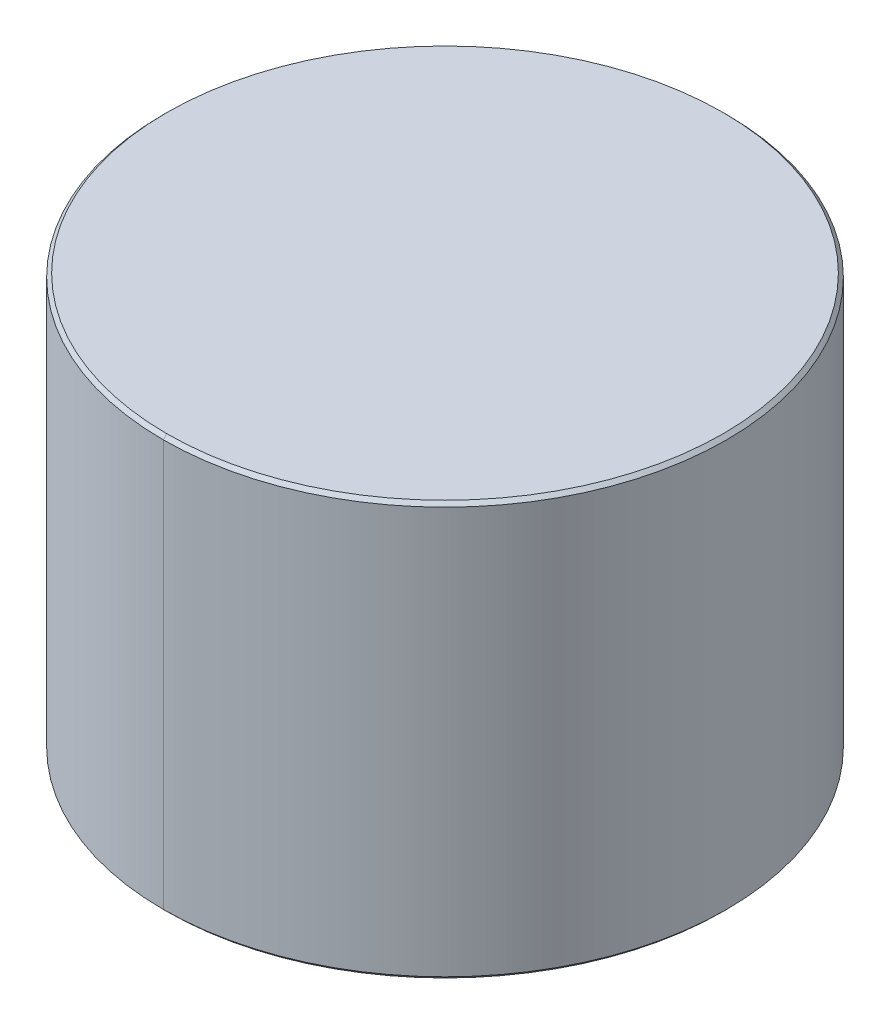
ISO-10303-21;
HEADER;
FILE_DESCRIPTION(('STEP AP214'),'2;1');
FILE_NAME('part.step','',(''),(''),'','','');
FILE_SCHEMA(('AUTOMOTIVE_DESIGN { 1 0 10303 214 1 1 1 1 }'));
ENDSEC;
DATA;
#1=APPLICATION_CONTEXT('core data for automotive mechanical design processes');
#2=APPLICATION_PROTOCOL_DEFINITION('international standard','automotive_design',2000,#1);
#3=PRODUCT_CONTEXT('',#1,'mechanical');
#4=PRODUCT('Part','Part','',(#3));
#5=PRODUCT_RELATED_PRODUCT_CATEGORY('part','',(#4));
#6=PRODUCT_DEFINITION_FORMATION('','',#4);
#7=PRODUCT_DEFINITION_CONTEXT('part definition',#1,'design');
#8=PRODUCT_DEFINITION('design','',#6,#7);
#9=PRODUCT_DEFINITION_SHAPE('','',#8);
#10=(LENGTH_UNIT() NAMED_UNIT(*) SI_UNIT(.MILLI.,.METRE.));
#11=(NAMED_UNIT(*) PLANE_ANGLE_UNIT() SI_UNIT($,.RADIAN.));
#12=(NAMED_UNIT(*) SI_UNIT($,.STERADIAN.) SOLID_ANGLE_UNIT());
#13=UNCERTAINTY_MEASURE_WITH_UNIT(LENGTH_MEASURE(1.E-05),#10,'distance_accuracy_value','');
#14=(GEOMETRIC_REPRESENTATION_CONTEXT(3) GLOBAL_UNCERTAINTY_ASSIGNED_CONTEXT((#13)) GLOBAL_UNIT_ASSIGNED_CONTEXT((#10,
#11,#12)) REPRESENTATION_CONTEXT('',''));
#15=CARTESIAN_POINT('',(0.,0.,0.));
#16=DIRECTION('',(0.,0.,1.));
#17=DIRECTION('',(1.,0.,0.));
#18=AXIS2_PLACEMENT_3D('',#15,#16,#17);
#19=CARTESIAN_POINT('',(0.,23.5,0.));
#20=DIRECTION('',(0.,-1.,0.));
#21=DIRECTION('',(0.,0.,-1.));
#22=AXIS2_PLACEMENT_3D('',#19,#20,#21);
#23=CONICAL_SURFACE('',#22,15.8,0.785398163397448);
#24=CARTESIAN_POINT('',(0.,23.5,0.));
#25=DIRECTION('',(0.,1.,0.));
#26=DIRECTION('',(0.,0.,1.));
#27=AXIS2_PLACEMENT_3D('',#24,#25,#26);
#28=CIRCLE('',#27,15.8);
#29=CARTESIAN_POINT('',(0.,23.5,15.8));
#30=VERTEX_POINT('',#29);
#31=CARTESIAN_POINT('',(0.,23.5,-15.8));
#32=VERTEX_POINT('',#31);
#33=EDGE_CURVE('E41',#30,#32,#28,.T.);
#34=ORIENTED_EDGE('',*,*,#33,.F.);
#35=DIRECTION('',(0.,-0.707106781186548,0.707106781186548));
#36=VECTOR('',#35,1.);
#37=CARTESIAN_POINT('',(0.,23.5,15.8));
#38=LINE('',#37,#36);
#39=CARTESIAN_POINT('',(0.,23.3,16.));
#40=VERTEX_POINT('',#39);
#41=EDGE_CURVE('E11',#30,#40,#38,.T.);
#42=ORIENTED_EDGE('',*,*,#41,.T.);
#43=CARTESIAN_POINT('',(0.,23.3,0.));
#44=DIRECTION('',(0.,-1.,0.));
#45=DIRECTION('',(0.,0.,1.));
#46=AXIS2_PLACEMENT_3D('',#43,#44,#45);
#47=CIRCLE('',#46,16.);
#48=CARTESIAN_POINT('',(0.,23.3,-16.));
#49=VERTEX_POINT('',#48);
#50=EDGE_CURVE('E84',#49,#40,#47,.T.);
#51=ORIENTED_EDGE('',*,*,#50,.F.);
#52=DIRECTION('',(0.,-0.707106781186548,-0.707106781186548));
#53=VECTOR('',#52,1.);
#54=CARTESIAN_POINT('',(0.,23.5,-15.8));
#55=LINE('',#54,#53);
#56=EDGE_CURVE('E111',#32,#49,#55,.T.);
#57=ORIENTED_EDGE('',*,*,#56,.F.);
#58=EDGE_LOOP('',(#34,#42,#51,#57));
#59=FACE_BOUND('',#58,.T.);
#60=ADVANCED_FACE('F16',(#59),#23,.T.);
#61=CARTESIAN_POINT('',(0.,0.2,0.));
#62=DIRECTION('',(0.,1.,0.));
#63=DIRECTION('',(0.,0.,1.));
#64=AXIS2_PLACEMENT_3D('',#61,#62,#63);
#65=CONICAL_SURFACE('',#64,16.,0.785398163397448);
#66=CARTESIAN_POINT('',(0.,0.,0.));
#67=DIRECTION('',(0.,-1.,0.));
#68=DIRECTION('',(0.,0.,1.));
#69=AXIS2_PLACEMENT_3D('',#66,#67,#68);
#70=CIRCLE('',#69,15.8);
#71=CARTESIAN_POINT('',(0.,0.,-15.8));
#72=VERTEX_POINT('',#71);
#73=CARTESIAN_POINT('',(0.,0.,15.8));
#74=VERTEX_POINT('',#73);
#75=EDGE_CURVE('E69',#72,#74,#70,.T.);
#76=ORIENTED_EDGE('',*,*,#75,.F.);
#77=DIRECTION('',(0.,0.707106781186548,-0.707106781186548));
#78=VECTOR('',#77,1.);
#79=CARTESIAN_POINT('',(0.,0.2,-16.));
#80=LINE('',#79,#78);
#81=CARTESIAN_POINT('',(0.,0.2,-16.));
#82=VERTEX_POINT('',#81);
#83=EDGE_CURVE('E27',#72,#82,#80,.T.);
#84=ORIENTED_EDGE('',*,*,#83,.T.);
#85=CARTESIAN_POINT('',(0.,0.2,0.));
#86=DIRECTION('',(0.,1.,0.));
#87=DIRECTION('',(0.,0.,1.));
#88=AXIS2_PLACEMENT_3D('',#85,#86,#87);
#89=CIRCLE('',#88,16.);
#90=CARTESIAN_POINT('',(0.,0.2,16.));
#91=VERTEX_POINT('',#90);
#92=EDGE_CURVE('E116',#91,#82,#89,.T.);
#93=ORIENTED_EDGE('',*,*,#92,.F.);
#94=DIRECTION('',(0.,0.707106781186548,0.707106781186548));
#95=VECTOR('',#94,1.);
#96=CARTESIAN_POINT('',(0.,0.2,16.));
#97=LINE('',#96,#95);
#98=EDGE_CURVE('E73',#74,#91,#97,.T.);
#99=ORIENTED_EDGE('',*,*,#98,.F.);
#100=EDGE_LOOP('',(#76,#84,#93,#99));
#101=FACE_BOUND('',#100,.T.);
#102=ADVANCED_FACE('F18',(#101),#65,.T.);
#103=CARTESIAN_POINT('',(0.,23.5,0.));
#104=DIRECTION('',(0.,-1.,0.));
#105=DIRECTION('',(0.,0.,-1.));
#106=AXIS2_PLACEMENT_3D('',#103,#104,#105);
#107=CYLINDRICAL_SURFACE('',#106,16.);
#108=ORIENTED_EDGE('',*,*,#50,.T.);
#109=DIRECTION('',(0.,-1.,0.));
#110=VECTOR('',#109,1.);
#111=CARTESIAN_POINT('',(0.,23.5,16.));
#112=LINE('',#111,#110);
#113=EDGE_CURVE('E110',#40,#91,#112,.T.);
#114=ORIENTED_EDGE('',*,*,#113,.T.);
#115=ORIENTED_EDGE('',*,*,#92,.T.);
#116=DIRECTION('',(0.,-1.,0.));
#117=VECTOR('',#116,1.);
#118=CARTESIAN_POINT('',(0.,23.5,-16.));
#119=LINE('',#118,#117);
#120=EDGE_CURVE('E128',#49,#82,#119,.T.);
#121=ORIENTED_EDGE('',*,*,#120,.F.);
#122=EDGE_LOOP('',(#108,#114,#115,#121));
#123=FACE_BOUND('',#122,.T.);
#124=ADVANCED_FACE('F121',(#123),#107,.T.);
#125=CARTESIAN_POINT('',(0.,23.5,0.));
#126=DIRECTION('',(0.,-1.,0.));
#127=DIRECTION('',(0.,0.,-1.));
#128=AXIS2_PLACEMENT_3D('',#125,#126,#127);
#129=CYLINDRICAL_SURFACE('',#128,16.);
#130=ORIENTED_EDGE('',*,*,#113,.F.);
#131=CARTESIAN_POINT('',(0.,23.3,0.));
#132=DIRECTION('',(0.,-1.,0.));
#133=DIRECTION('',(0.,0.,1.));
#134=AXIS2_PLACEMENT_3D('',#131,#132,#133);
#135=CIRCLE('',#134,16.);
#136=EDGE_CURVE('E104',#40,#49,#135,.T.);
#137=ORIENTED_EDGE('',*,*,#136,.T.);
#138=ORIENTED_EDGE('',*,*,#120,.T.);
#139=CARTESIAN_POINT('',(0.,0.2,0.));
#140=DIRECTION('',(0.,1.,0.));
#141=DIRECTION('',(0.,0.,1.));
#142=AXIS2_PLACEMENT_3D('',#139,#140,#141);
#143=CIRCLE('',#142,16.);
#144=EDGE_CURVE('E82',#82,#91,#143,.T.);
#145=ORIENTED_EDGE('',*,*,#144,.T.);
#146=EDGE_LOOP('',(#130,#137,#138,#145));
#147=FACE_BOUND('',#146,.T.);
#148=ADVANCED_FACE('F127',(#147),#129,.T.);
#149=CARTESIAN_POINT('',(0.,23.5,0.));
#150=DIRECTION('',(0.,1.,0.));
#151=DIRECTION('',(1.,0.,0.));
#152=AXIS2_PLACEMENT_3D('',#149,#150,#151);
#153=PLANE('',#152);
#154=CARTESIAN_POINT('',(0.,23.5,0.));
#155=DIRECTION('',(0.,1.,0.));
#156=DIRECTION('',(0.,0.,1.));
#157=AXIS2_PLACEMENT_3D('',#154,#155,#156);
#158=CIRCLE('',#157,15.8);
#159=EDGE_CURVE('E93',#32,#30,#158,.T.);
#160=ORIENTED_EDGE('',*,*,#159,.T.);
#161=ORIENTED_EDGE('',*,*,#33,.T.);
#162=EDGE_LOOP('',(#160,#161));
#163=FACE_BOUND('',#162,.T.);
#164=ADVANCED_FACE('F152',(#163),#153,.T.);
#165=CARTESIAN_POINT('',(0.,0.,0.));
#166=DIRECTION('',(0.,1.,0.));
#167=DIRECTION('',(1.,0.,0.));
#168=AXIS2_PLACEMENT_3D('',#165,#166,#167);
#169=PLANE('',#168);
#170=CARTESIAN_POINT('',(0.,0.,0.));
#171=DIRECTION('',(0.,-1.,0.));
#172=DIRECTION('',(0.,0.,1.));
#173=AXIS2_PLACEMENT_3D('',#170,#171,#172);
#174=CIRCLE('',#173,15.8);
#175=EDGE_CURVE('E20',#74,#72,#174,.T.);
#176=ORIENTED_EDGE('',*,*,#175,.T.);
#177=ORIENTED_EDGE('',*,*,#75,.T.);
#178=EDGE_LOOP('',(#176,#177));
#179=FACE_BOUND('',#178,.T.);
#180=ADVANCED_FACE('F86',(#179),#169,.F.);
#181=CARTESIAN_POINT('',(0.,0.2,0.));
#182=DIRECTION('',(0.,1.,0.));
#183=DIRECTION('',(0.,0.,1.));
#184=AXIS2_PLACEMENT_3D('',#181,#182,#183);
#185=CONICAL_SURFACE('',#184,16.,0.785398163397448);
#186=ORIENTED_EDGE('',*,*,#83,.F.);
#187=ORIENTED_EDGE('',*,*,#175,.F.);
#188=ORIENTED_EDGE('',*,*,#98,.T.);
#189=ORIENTED_EDGE('',*,*,#144,.F.);
#190=EDGE_LOOP('',(#186,#187,#188,#189));
#191=FACE_BOUND('',#190,.T.);
#192=ADVANCED_FACE('F80',(#191),#185,.T.);
#193=CARTESIAN_POINT('',(0.,23.5,0.));
#194=DIRECTION('',(0.,-1.,0.));
#195=DIRECTION('',(0.,0.,-1.));
#196=AXIS2_PLACEMENT_3D('',#193,#194,#195);
#197=CONICAL_SURFACE('',#196,15.8,0.785398163397448);
#198=ORIENTED_EDGE('',*,*,#41,.F.);
#199=ORIENTED_EDGE('',*,*,#159,.F.);
#200=ORIENTED_EDGE('',*,*,#56,.T.);
#201=ORIENTED_EDGE('',*,*,#136,.F.);
#202=EDGE_LOOP('',(#198,#199,#200,#201));
#203=FACE_BOUND('',#202,.T.);
#204=ADVANCED_FACE('F141',(#203),#197,.T.);
#205=CLOSED_SHELL('',(#60,#102,#124,#148,#164,#180,#192,#204));
#206=MANIFOLD_SOLID_BREP('B1',#205);
#207=ADVANCED_BREP_SHAPE_REPRESENTATION('',(#18,#206),#14);
#208=SHAPE_DEFINITION_REPRESENTATION(#9,#207);
ENDSEC;
END-ISO-10303-21;
